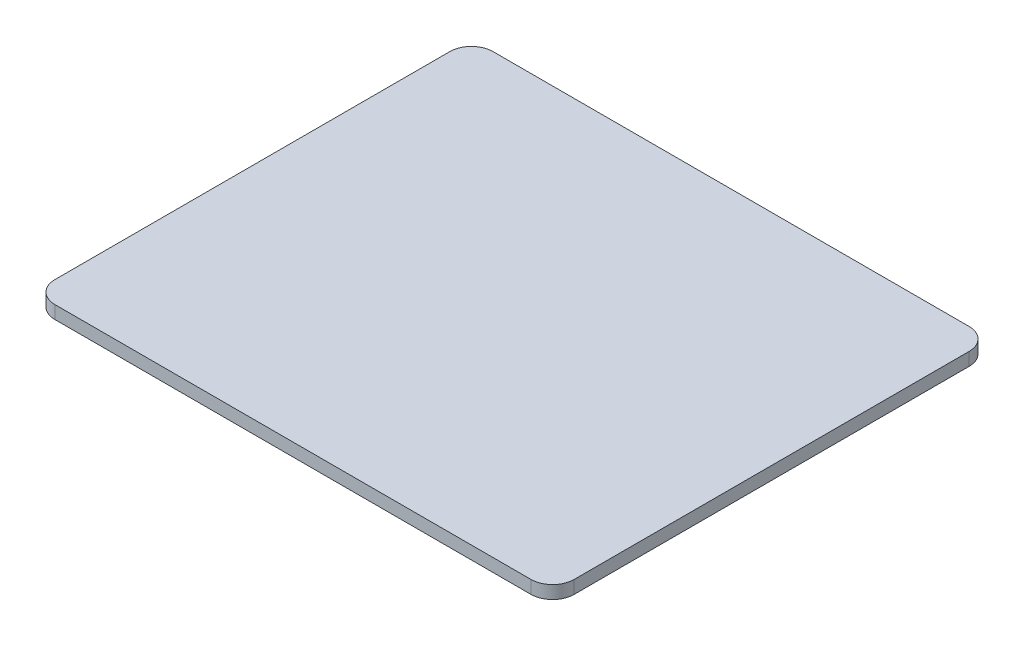
ISO-10303-21;
HEADER;
FILE_DESCRIPTION(('STEP AP214'),'2;1');
FILE_NAME('part.step','',(''),(''),'','','');
FILE_SCHEMA(('AUTOMOTIVE_DESIGN { 1 0 10303 214 1 1 1 1 }'));
ENDSEC;
DATA;
#1=APPLICATION_CONTEXT('core data for automotive mechanical design processes');
#2=APPLICATION_PROTOCOL_DEFINITION('international standard','automotive_design',2000,#1);
#3=PRODUCT_CONTEXT('',#1,'mechanical');
#4=PRODUCT('Part','Part','',(#3));
#5=PRODUCT_RELATED_PRODUCT_CATEGORY('part','',(#4));
#6=PRODUCT_DEFINITION_FORMATION('','',#4);
#7=PRODUCT_DEFINITION_CONTEXT('part definition',#1,'design');
#8=PRODUCT_DEFINITION('design','',#6,#7);
#9=PRODUCT_DEFINITION_SHAPE('','',#8);
#10=(LENGTH_UNIT() NAMED_UNIT(*) SI_UNIT(.MILLI.,.METRE.));
#11=(NAMED_UNIT(*) PLANE_ANGLE_UNIT() SI_UNIT($,.RADIAN.));
#12=(NAMED_UNIT(*) SI_UNIT($,.STERADIAN.) SOLID_ANGLE_UNIT());
#13=UNCERTAINTY_MEASURE_WITH_UNIT(LENGTH_MEASURE(1.E-05),#10,'distance_accuracy_value','');
#14=(GEOMETRIC_REPRESENTATION_CONTEXT(3) GLOBAL_UNCERTAINTY_ASSIGNED_CONTEXT((#13)) GLOBAL_UNIT_ASSIGNED_CONTEXT((#10,
#11,#12)) REPRESENTATION_CONTEXT('',''));
#15=CARTESIAN_POINT('',(0.,0.,0.));
#16=DIRECTION('',(0.,0.,1.));
#17=DIRECTION('',(1.,0.,0.));
#18=AXIS2_PLACEMENT_3D('',#15,#16,#17);
#19=CARTESIAN_POINT('',(60.,3.,50.625));
#20=DIRECTION('',(-1.,0.,0.));
#21=DIRECTION('',(0.,0.,1.));
#22=AXIS2_PLACEMENT_3D('',#19,#20,#21);
#23=PLANE('',#22);
#24=DIRECTION('',(0.,0.,-1.));
#25=VECTOR('',#24,1.);
#26=CARTESIAN_POINT('',(60.,0.,50.625));
#27=LINE('',#26,#25);
#28=CARTESIAN_POINT('',(60.,0.,45.625));
#29=VERTEX_POINT('',#28);
#30=CARTESIAN_POINT('',(60.,0.,-45.625));
#31=VERTEX_POINT('',#30);
#32=EDGE_CURVE('E132',#29,#31,#27,.T.);
#33=ORIENTED_EDGE('',*,*,#32,.T.);
#34=DIRECTION('',(0.,-1.,0.));
#35=VECTOR('',#34,1.);
#36=CARTESIAN_POINT('',(60.,3.,-45.625));
#37=LINE('',#36,#35);
#38=CARTESIAN_POINT('',(60.,3.,-45.625));
#39=VERTEX_POINT('',#38);
#40=EDGE_CURVE('E155',#31,#39,#37,.F.);
#41=ORIENTED_EDGE('',*,*,#40,.T.);
#42=DIRECTION('',(0.,0.,-1.));
#43=VECTOR('',#42,1.);
#44=CARTESIAN_POINT('',(60.,3.,50.625));
#45=LINE('',#44,#43);
#46=CARTESIAN_POINT('',(60.,3.,45.625));
#47=VERTEX_POINT('',#46);
#48=EDGE_CURVE('E130',#47,#39,#45,.T.);
#49=ORIENTED_EDGE('',*,*,#48,.F.);
#50=DIRECTION('',(0.,-1.,0.));
#51=VECTOR('',#50,1.);
#52=CARTESIAN_POINT('',(60.,3.,45.625));
#53=LINE('',#52,#51);
#54=EDGE_CURVE('E152',#47,#29,#53,.T.);
#55=ORIENTED_EDGE('',*,*,#54,.T.);
#56=EDGE_LOOP('',(#33,#41,#49,#55));
#57=FACE_BOUND('',#56,.T.);
#58=ADVANCED_FACE('F37',(#57),#23,.F.);
#59=CARTESIAN_POINT('',(-60.,3.,-50.625));
#60=DIRECTION('',(0.,0.,1.));
#61=DIRECTION('',(1.,0.,0.));
#62=AXIS2_PLACEMENT_3D('',#59,#60,#61);
#63=PLANE('',#62);
#64=DIRECTION('',(-1.,0.,0.));
#65=VECTOR('',#64,1.);
#66=CARTESIAN_POINT('',(-60.,0.,-50.625));
#67=LINE('',#66,#65);
#68=CARTESIAN_POINT('',(55.,0.,-50.625));
#69=VERTEX_POINT('',#68);
#70=CARTESIAN_POINT('',(-55.,0.,-50.625));
#71=VERTEX_POINT('',#70);
#72=EDGE_CURVE('E128',#69,#71,#67,.T.);
#73=ORIENTED_EDGE('',*,*,#72,.T.);
#74=DIRECTION('',(0.,-1.,0.));
#75=VECTOR('',#74,1.);
#76=CARTESIAN_POINT('',(-55.,3.,-50.625));
#77=LINE('',#76,#75);
#78=CARTESIAN_POINT('',(-55.,3.,-50.625));
#79=VERTEX_POINT('',#78);
#80=EDGE_CURVE('E107',#71,#79,#77,.F.);
#81=ORIENTED_EDGE('',*,*,#80,.T.);
#82=DIRECTION('',(-1.,0.,0.));
#83=VECTOR('',#82,1.);
#84=CARTESIAN_POINT('',(-60.,3.,-50.625));
#85=LINE('',#84,#83);
#86=CARTESIAN_POINT('',(55.,3.,-50.625));
#87=VERTEX_POINT('',#86);
#88=EDGE_CURVE('E171',#87,#79,#85,.T.);
#89=ORIENTED_EDGE('',*,*,#88,.F.);
#90=DIRECTION('',(0.,-1.,0.));
#91=VECTOR('',#90,1.);
#92=CARTESIAN_POINT('',(55.,3.,-50.625));
#93=LINE('',#92,#91);
#94=EDGE_CURVE('E112',#87,#69,#93,.T.);
#95=ORIENTED_EDGE('',*,*,#94,.T.);
#96=EDGE_LOOP('',(#73,#81,#89,#95));
#97=FACE_BOUND('',#96,.T.);
#98=ADVANCED_FACE('F188',(#97),#63,.F.);
#99=CARTESIAN_POINT('',(-60.,3.,50.625));
#100=DIRECTION('',(1.,0.,0.));
#101=DIRECTION('',(0.,0.,-1.));
#102=AXIS2_PLACEMENT_3D('',#99,#100,#101);
#103=PLANE('',#102);
#104=DIRECTION('',(0.,0.,1.));
#105=VECTOR('',#104,1.);
#106=CARTESIAN_POINT('',(-60.,3.,50.625));
#107=LINE('',#106,#105);
#108=CARTESIAN_POINT('',(-60.,3.,-45.625));
#109=VERTEX_POINT('',#108);
#110=CARTESIAN_POINT('',(-60.,3.,45.625));
#111=VERTEX_POINT('',#110);
#112=EDGE_CURVE('E121',#109,#111,#107,.T.);
#113=ORIENTED_EDGE('',*,*,#112,.F.);
#114=DIRECTION('',(0.,-1.,0.));
#115=VECTOR('',#114,1.);
#116=CARTESIAN_POINT('',(-60.,3.,-45.625));
#117=LINE('',#116,#115);
#118=CARTESIAN_POINT('',(-60.,0.,-45.625));
#119=VERTEX_POINT('',#118);
#120=EDGE_CURVE('E106',#109,#119,#117,.T.);
#121=ORIENTED_EDGE('',*,*,#120,.T.);
#122=DIRECTION('',(0.,0.,1.));
#123=VECTOR('',#122,1.);
#124=CARTESIAN_POINT('',(-60.,0.,50.625));
#125=LINE('',#124,#123);
#126=CARTESIAN_POINT('',(-60.,0.,45.625));
#127=VERTEX_POINT('',#126);
#128=EDGE_CURVE('E119',#119,#127,#125,.T.);
#129=ORIENTED_EDGE('',*,*,#128,.T.);
#130=DIRECTION('',(0.,-1.,0.));
#131=VECTOR('',#130,1.);
#132=CARTESIAN_POINT('',(-60.,3.,45.625));
#133=LINE('',#132,#131);
#134=EDGE_CURVE('E123',#127,#111,#133,.F.);
#135=ORIENTED_EDGE('',*,*,#134,.T.);
#136=EDGE_LOOP('',(#113,#121,#129,#135));
#137=FACE_BOUND('',#136,.T.);
#138=ADVANCED_FACE('F118',(#137),#103,.F.);
#139=CARTESIAN_POINT('',(-60.,3.,50.625));
#140=DIRECTION('',(0.,0.,-1.));
#141=DIRECTION('',(-1.,0.,0.));
#142=AXIS2_PLACEMENT_3D('',#139,#140,#141);
#143=PLANE('',#142);
#144=DIRECTION('',(1.,0.,0.));
#145=VECTOR('',#144,1.);
#146=CARTESIAN_POINT('',(-60.,0.,50.625));
#147=LINE('',#146,#145);
#148=CARTESIAN_POINT('',(-55.,0.,50.625));
#149=VERTEX_POINT('',#148);
#150=CARTESIAN_POINT('',(55.,0.,50.625));
#151=VERTEX_POINT('',#150);
#152=EDGE_CURVE('E127',#149,#151,#147,.T.);
#153=ORIENTED_EDGE('',*,*,#152,.T.);
#154=DIRECTION('',(0.,-1.,0.));
#155=VECTOR('',#154,1.);
#156=CARTESIAN_POINT('',(55.,3.,50.625));
#157=LINE('',#156,#155);
#158=CARTESIAN_POINT('',(55.,3.,50.625));
#159=VERTEX_POINT('',#158);
#160=EDGE_CURVE('E11',#151,#159,#157,.F.);
#161=ORIENTED_EDGE('',*,*,#160,.T.);
#162=DIRECTION('',(1.,0.,0.));
#163=VECTOR('',#162,1.);
#164=CARTESIAN_POINT('',(-60.,3.,50.625));
#165=LINE('',#164,#163);
#166=CARTESIAN_POINT('',(-55.,3.,50.625));
#167=VERTEX_POINT('',#166);
#168=EDGE_CURVE('E136',#167,#159,#165,.T.);
#169=ORIENTED_EDGE('',*,*,#168,.F.);
#170=DIRECTION('',(0.,-1.,0.));
#171=VECTOR('',#170,1.);
#172=CARTESIAN_POINT('',(-55.,3.,50.625));
#173=LINE('',#172,#171);
#174=EDGE_CURVE('E45',#167,#149,#173,.T.);
#175=ORIENTED_EDGE('',*,*,#174,.T.);
#176=EDGE_LOOP('',(#153,#161,#169,#175));
#177=FACE_BOUND('',#176,.T.);
#178=ADVANCED_FACE('F158',(#177),#143,.F.);
#179=CARTESIAN_POINT('',(0.,3.,0.));
#180=DIRECTION('',(0.,-1.,0.));
#181=DIRECTION('',(0.,0.,-1.));
#182=AXIS2_PLACEMENT_3D('',#179,#180,#181);
#183=PLANE('',#182);
#184=ORIENTED_EDGE('',*,*,#88,.T.);
#185=CARTESIAN_POINT('',(-55.,3.,-45.625));
#186=DIRECTION('',(0.,-1.,0.));
#187=DIRECTION('',(0.,0.,-1.));
#188=AXIS2_PLACEMENT_3D('',#185,#186,#187);
#189=CIRCLE('',#188,5.);
#190=EDGE_CURVE('E150',#79,#109,#189,.F.);
#191=ORIENTED_EDGE('',*,*,#190,.T.);
#192=ORIENTED_EDGE('',*,*,#112,.T.);
#193=CARTESIAN_POINT('',(-55.,3.,45.625));
#194=DIRECTION('',(0.,-1.,0.));
#195=DIRECTION('',(0.,0.,-1.));
#196=AXIS2_PLACEMENT_3D('',#193,#194,#195);
#197=CIRCLE('',#196,5.);
#198=EDGE_CURVE('E57',#111,#167,#197,.F.);
#199=ORIENTED_EDGE('',*,*,#198,.T.);
#200=ORIENTED_EDGE('',*,*,#168,.T.);
#201=CARTESIAN_POINT('',(55.,3.,45.625));
#202=DIRECTION('',(0.,-1.,0.));
#203=DIRECTION('',(0.,0.,-1.));
#204=AXIS2_PLACEMENT_3D('',#201,#202,#203);
#205=CIRCLE('',#204,5.);
#206=EDGE_CURVE('E146',#159,#47,#205,.F.);
#207=ORIENTED_EDGE('',*,*,#206,.T.);
#208=ORIENTED_EDGE('',*,*,#48,.T.);
#209=CARTESIAN_POINT('',(55.,3.,-45.625));
#210=DIRECTION('',(0.,-1.,0.));
#211=DIRECTION('',(0.,0.,-1.));
#212=AXIS2_PLACEMENT_3D('',#209,#210,#211);
#213=CIRCLE('',#212,5.);
#214=EDGE_CURVE('E148',#39,#87,#213,.F.);
#215=ORIENTED_EDGE('',*,*,#214,.T.);
#216=EDGE_LOOP('',(#184,#191,#192,#199,#200,#207,#208,#215));
#217=FACE_BOUND('',#216,.T.);
#218=ADVANCED_FACE('F177',(#217),#183,.F.);
#219=CARTESIAN_POINT('',(0.,0.,0.));
#220=DIRECTION('',(0.,-1.,0.));
#221=DIRECTION('',(0.,0.,-1.));
#222=AXIS2_PLACEMENT_3D('',#219,#220,#221);
#223=PLANE('',#222);
#224=ORIENTED_EDGE('',*,*,#128,.F.);
#225=CARTESIAN_POINT('',(-55.,0.,-45.625));
#226=DIRECTION('',(0.,-1.,0.));
#227=DIRECTION('',(0.,0.,-1.));
#228=AXIS2_PLACEMENT_3D('',#225,#226,#227);
#229=CIRCLE('',#228,5.);
#230=EDGE_CURVE('E102',#119,#71,#229,.T.);
#231=ORIENTED_EDGE('',*,*,#230,.T.);
#232=ORIENTED_EDGE('',*,*,#72,.F.);
#233=CARTESIAN_POINT('',(55.,0.,-45.625));
#234=DIRECTION('',(0.,-1.,0.));
#235=DIRECTION('',(0.,0.,-1.));
#236=AXIS2_PLACEMENT_3D('',#233,#234,#235);
#237=CIRCLE('',#236,5.);
#238=EDGE_CURVE('E113',#69,#31,#237,.T.);
#239=ORIENTED_EDGE('',*,*,#238,.T.);
#240=ORIENTED_EDGE('',*,*,#32,.F.);
#241=CARTESIAN_POINT('',(55.,0.,45.625));
#242=DIRECTION('',(0.,-1.,0.));
#243=DIRECTION('',(0.,0.,-1.));
#244=AXIS2_PLACEMENT_3D('',#241,#242,#243);
#245=CIRCLE('',#244,5.);
#246=EDGE_CURVE('E139',#29,#151,#245,.T.);
#247=ORIENTED_EDGE('',*,*,#246,.T.);
#248=ORIENTED_EDGE('',*,*,#152,.F.);
#249=CARTESIAN_POINT('',(-55.,0.,45.625));
#250=DIRECTION('',(0.,-1.,0.));
#251=DIRECTION('',(0.,0.,-1.));
#252=AXIS2_PLACEMENT_3D('',#249,#250,#251);
#253=CIRCLE('',#252,5.);
#254=EDGE_CURVE('E122',#149,#127,#253,.T.);
#255=ORIENTED_EDGE('',*,*,#254,.T.);
#256=EDGE_LOOP('',(#224,#231,#232,#239,#240,#247,#248,#255));
#257=FACE_BOUND('',#256,.T.);
#258=ADVANCED_FACE('F125',(#257),#223,.T.);
#259=CARTESIAN_POINT('',(-55.,3.,-45.625));
#260=DIRECTION('',(0.,-1.,0.));
#261=DIRECTION('',(0.,0.,-1.));
#262=AXIS2_PLACEMENT_3D('',#259,#260,#261);
#263=CYLINDRICAL_SURFACE('',#262,5.);
#264=ORIENTED_EDGE('',*,*,#190,.F.);
#265=ORIENTED_EDGE('',*,*,#80,.F.);
#266=ORIENTED_EDGE('',*,*,#230,.F.);
#267=ORIENTED_EDGE('',*,*,#120,.F.);
#268=EDGE_LOOP('',(#264,#265,#266,#267));
#269=FACE_BOUND('',#268,.T.);
#270=ADVANCED_FACE('F105',(#269),#263,.T.);
#271=CARTESIAN_POINT('',(55.,3.,-45.625));
#272=DIRECTION('',(0.,-1.,0.));
#273=DIRECTION('',(0.,0.,-1.));
#274=AXIS2_PLACEMENT_3D('',#271,#272,#273);
#275=CYLINDRICAL_SURFACE('',#274,5.);
#276=ORIENTED_EDGE('',*,*,#214,.F.);
#277=ORIENTED_EDGE('',*,*,#40,.F.);
#278=ORIENTED_EDGE('',*,*,#238,.F.);
#279=ORIENTED_EDGE('',*,*,#94,.F.);
#280=EDGE_LOOP('',(#276,#277,#278,#279));
#281=FACE_BOUND('',#280,.T.);
#282=ADVANCED_FACE('F199',(#281),#275,.T.);
#283=CARTESIAN_POINT('',(55.,3.,45.625));
#284=DIRECTION('',(0.,-1.,0.));
#285=DIRECTION('',(0.,0.,-1.));
#286=AXIS2_PLACEMENT_3D('',#283,#284,#285);
#287=CYLINDRICAL_SURFACE('',#286,5.);
#288=ORIENTED_EDGE('',*,*,#206,.F.);
#289=ORIENTED_EDGE('',*,*,#160,.F.);
#290=ORIENTED_EDGE('',*,*,#246,.F.);
#291=ORIENTED_EDGE('',*,*,#54,.F.);
#292=EDGE_LOOP('',(#288,#289,#290,#291));
#293=FACE_BOUND('',#292,.T.);
#294=ADVANCED_FACE('F165',(#293),#287,.T.);
#295=CARTESIAN_POINT('',(-55.,3.,45.625));
#296=DIRECTION('',(0.,-1.,0.));
#297=DIRECTION('',(0.,0.,-1.));
#298=AXIS2_PLACEMENT_3D('',#295,#296,#297);
#299=CYLINDRICAL_SURFACE('',#298,5.);
#300=ORIENTED_EDGE('',*,*,#198,.F.);
#301=ORIENTED_EDGE('',*,*,#134,.F.);
#302=ORIENTED_EDGE('',*,*,#254,.F.);
#303=ORIENTED_EDGE('',*,*,#174,.F.);
#304=EDGE_LOOP('',(#300,#301,#302,#303));
#305=FACE_BOUND('',#304,.T.);
#306=ADVANCED_FACE('F39',(#305),#299,.T.);
#307=CLOSED_SHELL('',(#58,#98,#138,#178,#218,#258,#270,#282,#294,#306));
#308=MANIFOLD_SOLID_BREP('B2',#307);
#309=ADVANCED_BREP_SHAPE_REPRESENTATION('',(#18,#308),#14);
#310=SHAPE_DEFINITION_REPRESENTATION(#9,#309);
ENDSEC;
END-ISO-10303-21;
